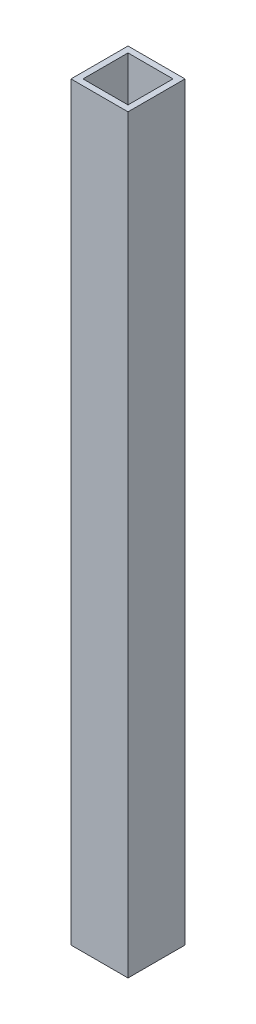
ISO-10303-21;
HEADER;
FILE_DESCRIPTION(('STEP AP214'),'2;1');
FILE_NAME('part.step','',(''),(''),'','','');
FILE_SCHEMA(('AUTOMOTIVE_DESIGN { 1 0 10303 214 1 1 1 1 }'));
ENDSEC;
DATA;
#1=APPLICATION_CONTEXT('core data for automotive mechanical design processes');
#2=APPLICATION_PROTOCOL_DEFINITION('international standard','automotive_design',2000,#1);
#3=PRODUCT_CONTEXT('',#1,'mechanical');
#4=PRODUCT('Part','Part','',(#3));
#5=PRODUCT_RELATED_PRODUCT_CATEGORY('part','',(#4));
#6=PRODUCT_DEFINITION_FORMATION('','',#4);
#7=PRODUCT_DEFINITION_CONTEXT('part definition',#1,'design');
#8=PRODUCT_DEFINITION('design','',#6,#7);
#9=PRODUCT_DEFINITION_SHAPE('','',#8);
#10=(LENGTH_UNIT() NAMED_UNIT(*) SI_UNIT(.MILLI.,.METRE.));
#11=(NAMED_UNIT(*) PLANE_ANGLE_UNIT() SI_UNIT($,.RADIAN.));
#12=(NAMED_UNIT(*) SI_UNIT($,.STERADIAN.) SOLID_ANGLE_UNIT());
#13=UNCERTAINTY_MEASURE_WITH_UNIT(LENGTH_MEASURE(1.E-05),#10,'distance_accuracy_value','');
#14=(GEOMETRIC_REPRESENTATION_CONTEXT(3) GLOBAL_UNCERTAINTY_ASSIGNED_CONTEXT((#13)) GLOBAL_UNIT_ASSIGNED_CONTEXT((#10,
#11,#12)) REPRESENTATION_CONTEXT('',''));
#15=CARTESIAN_POINT('',(0.,0.,0.));
#16=DIRECTION('',(0.,0.,1.));
#17=DIRECTION('',(1.,0.,0.));
#18=AXIS2_PLACEMENT_3D('',#15,#16,#17);
#19=CARTESIAN_POINT('',(0.,250.,0.));
#20=DIRECTION('',(0.,-1.,0.));
#21=DIRECTION('',(0.,0.,-1.));
#22=AXIS2_PLACEMENT_3D('',#19,#20,#21);
#23=PLANE('',#22);
#24=DIRECTION('',(0.,0.,-1.));
#25=VECTOR('',#24,1.);
#26=CARTESIAN_POINT('',(9.5,250.,9.5));
#27=LINE('',#26,#25);
#28=CARTESIAN_POINT('',(9.5,250.,9.5));
#29=VERTEX_POINT('',#28);
#30=CARTESIAN_POINT('',(9.5,250.,-9.5));
#31=VERTEX_POINT('',#30);
#32=EDGE_CURVE('E137',#29,#31,#27,.T.);
#33=ORIENTED_EDGE('',*,*,#32,.T.);
#34=DIRECTION('',(-1.,0.,0.));
#35=VECTOR('',#34,1.);
#36=CARTESIAN_POINT('',(-9.5,250.,-9.5));
#37=LINE('',#36,#35);
#38=CARTESIAN_POINT('',(-9.5,250.,-9.5));
#39=VERTEX_POINT('',#38);
#40=EDGE_CURVE('E140',#31,#39,#37,.T.);
#41=ORIENTED_EDGE('',*,*,#40,.T.);
#42=DIRECTION('',(0.,0.,1.));
#43=VECTOR('',#42,1.);
#44=CARTESIAN_POINT('',(-9.5,250.,9.5));
#45=LINE('',#44,#43);
#46=CARTESIAN_POINT('',(-9.5,250.,9.5));
#47=VERTEX_POINT('',#46);
#48=EDGE_CURVE('E143',#39,#47,#45,.T.);
#49=ORIENTED_EDGE('',*,*,#48,.T.);
#50=DIRECTION('',(1.,0.,0.));
#51=VECTOR('',#50,1.);
#52=CARTESIAN_POINT('',(-9.5,250.,9.5));
#53=LINE('',#52,#51);
#54=EDGE_CURVE('E145',#47,#29,#53,.T.);
#55=ORIENTED_EDGE('',*,*,#54,.T.);
#56=EDGE_LOOP('',(#33,#41,#49,#55));
#57=FACE_BOUND('',#56,.T.);
#58=DIRECTION('',(0.,0.,1.));
#59=VECTOR('',#58,1.);
#60=CARTESIAN_POINT('',(-7.5,250.,7.5));
#61=LINE('',#60,#59);
#62=CARTESIAN_POINT('',(-7.5,250.,-7.5));
#63=VERTEX_POINT('',#62);
#64=CARTESIAN_POINT('',(-7.5,250.,7.5));
#65=VERTEX_POINT('',#64);
#66=EDGE_CURVE('E101',#63,#65,#61,.T.);
#67=ORIENTED_EDGE('',*,*,#66,.F.);
#68=DIRECTION('',(-1.,0.,0.));
#69=VECTOR('',#68,1.);
#70=CARTESIAN_POINT('',(-7.5,250.,-7.5));
#71=LINE('',#70,#69);
#72=CARTESIAN_POINT('',(7.5,250.,-7.5));
#73=VERTEX_POINT('',#72);
#74=EDGE_CURVE('E123',#73,#63,#71,.T.);
#75=ORIENTED_EDGE('',*,*,#74,.F.);
#76=DIRECTION('',(0.,0.,-1.));
#77=VECTOR('',#76,1.);
#78=CARTESIAN_POINT('',(7.5,250.,7.5));
#79=LINE('',#78,#77);
#80=CARTESIAN_POINT('',(7.5,250.,7.5));
#81=VERTEX_POINT('',#80);
#82=EDGE_CURVE('E121',#81,#73,#79,.T.);
#83=ORIENTED_EDGE('',*,*,#82,.F.);
#84=DIRECTION('',(1.,0.,0.));
#85=VECTOR('',#84,1.);
#86=CARTESIAN_POINT('',(-7.5,250.,7.5));
#87=LINE('',#86,#85);
#88=EDGE_CURVE('E109',#65,#81,#87,.T.);
#89=ORIENTED_EDGE('',*,*,#88,.F.);
#90=EDGE_LOOP('',(#67,#75,#83,#89));
#91=FACE_BOUND('',#90,.T.);
#92=ADVANCED_FACE('F36',(#57,#91),#23,.F.);
#93=CARTESIAN_POINT('',(0.,0.,0.));
#94=DIRECTION('',(0.,-1.,0.));
#95=DIRECTION('',(0.,0.,-1.));
#96=AXIS2_PLACEMENT_3D('',#93,#94,#95);
#97=PLANE('',#96);
#98=DIRECTION('',(0.,0.,-1.));
#99=VECTOR('',#98,1.);
#100=CARTESIAN_POINT('',(9.5,0.,9.5));
#101=LINE('',#100,#99);
#102=CARTESIAN_POINT('',(9.5,0.,9.5));
#103=VERTEX_POINT('',#102);
#104=CARTESIAN_POINT('',(9.5,0.,-9.5));
#105=VERTEX_POINT('',#104);
#106=EDGE_CURVE('E117',#103,#105,#101,.T.);
#107=ORIENTED_EDGE('',*,*,#106,.F.);
#108=DIRECTION('',(1.,0.,0.));
#109=VECTOR('',#108,1.);
#110=CARTESIAN_POINT('',(-9.5,0.,9.5));
#111=LINE('',#110,#109);
#112=CARTESIAN_POINT('',(-9.5,0.,9.5));
#113=VERTEX_POINT('',#112);
#114=EDGE_CURVE('E141',#113,#103,#111,.T.);
#115=ORIENTED_EDGE('',*,*,#114,.F.);
#116=DIRECTION('',(0.,0.,1.));
#117=VECTOR('',#116,1.);
#118=CARTESIAN_POINT('',(-9.5,0.,9.5));
#119=LINE('',#118,#117);
#120=CARTESIAN_POINT('',(-9.5,0.,-9.5));
#121=VERTEX_POINT('',#120);
#122=EDGE_CURVE('E152',#121,#113,#119,.T.);
#123=ORIENTED_EDGE('',*,*,#122,.F.);
#124=DIRECTION('',(-1.,0.,0.));
#125=VECTOR('',#124,1.);
#126=CARTESIAN_POINT('',(-9.5,0.,-9.5));
#127=LINE('',#126,#125);
#128=EDGE_CURVE('E150',#105,#121,#127,.T.);
#129=ORIENTED_EDGE('',*,*,#128,.F.);
#130=EDGE_LOOP('',(#107,#115,#123,#129));
#131=FACE_BOUND('',#130,.T.);
#132=DIRECTION('',(-1.,0.,0.));
#133=VECTOR('',#132,1.);
#134=CARTESIAN_POINT('',(-7.5,0.,-7.5));
#135=LINE('',#134,#133);
#136=CARTESIAN_POINT('',(7.5,0.,-7.5));
#137=VERTEX_POINT('',#136);
#138=CARTESIAN_POINT('',(-7.5,0.,-7.5));
#139=VERTEX_POINT('',#138);
#140=EDGE_CURVE('E110',#137,#139,#135,.T.);
#141=ORIENTED_EDGE('',*,*,#140,.T.);
#142=DIRECTION('',(0.,0.,1.));
#143=VECTOR('',#142,1.);
#144=CARTESIAN_POINT('',(-7.5,0.,7.5));
#145=LINE('',#144,#143);
#146=CARTESIAN_POINT('',(-7.5,0.,7.5));
#147=VERTEX_POINT('',#146);
#148=EDGE_CURVE('E59',#139,#147,#145,.T.);
#149=ORIENTED_EDGE('',*,*,#148,.T.);
#150=DIRECTION('',(1.,0.,0.));
#151=VECTOR('',#150,1.);
#152=CARTESIAN_POINT('',(-7.5,0.,7.5));
#153=LINE('',#152,#151);
#154=CARTESIAN_POINT('',(7.5,0.,7.5));
#155=VERTEX_POINT('',#154);
#156=EDGE_CURVE('E116',#147,#155,#153,.T.);
#157=ORIENTED_EDGE('',*,*,#156,.T.);
#158=DIRECTION('',(0.,0.,-1.));
#159=VECTOR('',#158,1.);
#160=CARTESIAN_POINT('',(7.5,0.,7.5));
#161=LINE('',#160,#159);
#162=EDGE_CURVE('E129',#155,#137,#161,.T.);
#163=ORIENTED_EDGE('',*,*,#162,.T.);
#164=EDGE_LOOP('',(#141,#149,#157,#163));
#165=FACE_BOUND('',#164,.T.);
#166=ADVANCED_FACE('F170',(#131,#165),#97,.T.);
#167=CARTESIAN_POINT('',(9.5,250.,9.5));
#168=DIRECTION('',(-1.,0.,0.));
#169=DIRECTION('',(0.,0.,1.));
#170=AXIS2_PLACEMENT_3D('',#167,#168,#169);
#171=PLANE('',#170);
#172=ORIENTED_EDGE('',*,*,#106,.T.);
#173=DIRECTION('',(0.,-1.,0.));
#174=VECTOR('',#173,1.);
#175=CARTESIAN_POINT('',(9.5,250.,-9.5));
#176=LINE('',#175,#174);
#177=EDGE_CURVE('E11',#31,#105,#176,.T.);
#178=ORIENTED_EDGE('',*,*,#177,.F.);
#179=ORIENTED_EDGE('',*,*,#32,.F.);
#180=DIRECTION('',(0.,-1.,0.));
#181=VECTOR('',#180,1.);
#182=CARTESIAN_POINT('',(9.5,250.,9.5));
#183=LINE('',#182,#181);
#184=EDGE_CURVE('E147',#29,#103,#183,.T.);
#185=ORIENTED_EDGE('',*,*,#184,.T.);
#186=EDGE_LOOP('',(#172,#178,#179,#185));
#187=FACE_BOUND('',#186,.T.);
#188=ADVANCED_FACE('F38',(#187),#171,.F.);
#189=CARTESIAN_POINT('',(-9.5,250.,-9.5));
#190=DIRECTION('',(0.,0.,1.));
#191=DIRECTION('',(1.,0.,0.));
#192=AXIS2_PLACEMENT_3D('',#189,#190,#191);
#193=PLANE('',#192);
#194=ORIENTED_EDGE('',*,*,#128,.T.);
#195=DIRECTION('',(0.,-1.,0.));
#196=VECTOR('',#195,1.);
#197=CARTESIAN_POINT('',(-9.5,250.,-9.5));
#198=LINE('',#197,#196);
#199=EDGE_CURVE('E44',#39,#121,#198,.T.);
#200=ORIENTED_EDGE('',*,*,#199,.F.);
#201=ORIENTED_EDGE('',*,*,#40,.F.);
#202=ORIENTED_EDGE('',*,*,#177,.T.);
#203=EDGE_LOOP('',(#194,#200,#201,#202));
#204=FACE_BOUND('',#203,.T.);
#205=ADVANCED_FACE('F180',(#204),#193,.F.);
#206=CARTESIAN_POINT('',(-9.5,250.,9.5));
#207=DIRECTION('',(1.,0.,0.));
#208=DIRECTION('',(0.,0.,-1.));
#209=AXIS2_PLACEMENT_3D('',#206,#207,#208);
#210=PLANE('',#209);
#211=ORIENTED_EDGE('',*,*,#122,.T.);
#212=DIRECTION('',(0.,-1.,0.));
#213=VECTOR('',#212,1.);
#214=CARTESIAN_POINT('',(-9.5,250.,9.5));
#215=LINE('',#214,#213);
#216=EDGE_CURVE('E157',#47,#113,#215,.T.);
#217=ORIENTED_EDGE('',*,*,#216,.F.);
#218=ORIENTED_EDGE('',*,*,#48,.F.);
#219=ORIENTED_EDGE('',*,*,#199,.T.);
#220=EDGE_LOOP('',(#211,#217,#218,#219));
#221=FACE_BOUND('',#220,.T.);
#222=ADVANCED_FACE('F164',(#221),#210,.F.);
#223=CARTESIAN_POINT('',(-9.5,250.,9.5));
#224=DIRECTION('',(0.,0.,-1.));
#225=DIRECTION('',(-1.,0.,0.));
#226=AXIS2_PLACEMENT_3D('',#223,#224,#225);
#227=PLANE('',#226);
#228=ORIENTED_EDGE('',*,*,#114,.T.);
#229=ORIENTED_EDGE('',*,*,#184,.F.);
#230=ORIENTED_EDGE('',*,*,#54,.F.);
#231=ORIENTED_EDGE('',*,*,#216,.T.);
#232=EDGE_LOOP('',(#228,#229,#230,#231));
#233=FACE_BOUND('',#232,.T.);
#234=ADVANCED_FACE('F174',(#233),#227,.F.);
#235=CARTESIAN_POINT('',(-7.5,250.,7.5));
#236=DIRECTION('',(1.,0.,0.));
#237=DIRECTION('',(0.,0.,-1.));
#238=AXIS2_PLACEMENT_3D('',#235,#236,#237);
#239=PLANE('',#238);
#240=ORIENTED_EDGE('',*,*,#148,.F.);
#241=DIRECTION('',(0.,-1.,0.));
#242=VECTOR('',#241,1.);
#243=CARTESIAN_POINT('',(-7.5,250.,-7.5));
#244=LINE('',#243,#242);
#245=EDGE_CURVE('E105',#63,#139,#244,.T.);
#246=ORIENTED_EDGE('',*,*,#245,.F.);
#247=ORIENTED_EDGE('',*,*,#66,.T.);
#248=DIRECTION('',(0.,-1.,0.));
#249=VECTOR('',#248,1.);
#250=CARTESIAN_POINT('',(-7.5,250.,7.5));
#251=LINE('',#250,#249);
#252=EDGE_CURVE('E104',#65,#147,#251,.T.);
#253=ORIENTED_EDGE('',*,*,#252,.T.);
#254=EDGE_LOOP('',(#240,#246,#247,#253));
#255=FACE_BOUND('',#254,.T.);
#256=ADVANCED_FACE('F103',(#255),#239,.T.);
#257=CARTESIAN_POINT('',(-7.5,250.,7.5));
#258=DIRECTION('',(0.,0.,-1.));
#259=DIRECTION('',(-1.,0.,0.));
#260=AXIS2_PLACEMENT_3D('',#257,#258,#259);
#261=PLANE('',#260);
#262=ORIENTED_EDGE('',*,*,#156,.F.);
#263=ORIENTED_EDGE('',*,*,#252,.F.);
#264=ORIENTED_EDGE('',*,*,#88,.T.);
#265=DIRECTION('',(0.,-1.,0.));
#266=VECTOR('',#265,1.);
#267=CARTESIAN_POINT('',(7.5,250.,7.5));
#268=LINE('',#267,#266);
#269=EDGE_CURVE('E118',#81,#155,#268,.T.);
#270=ORIENTED_EDGE('',*,*,#269,.T.);
#271=EDGE_LOOP('',(#262,#263,#264,#270));
#272=FACE_BOUND('',#271,.T.);
#273=ADVANCED_FACE('F113',(#272),#261,.T.);
#274=CARTESIAN_POINT('',(7.5,250.,7.5));
#275=DIRECTION('',(-1.,0.,0.));
#276=DIRECTION('',(0.,0.,1.));
#277=AXIS2_PLACEMENT_3D('',#274,#275,#276);
#278=PLANE('',#277);
#279=ORIENTED_EDGE('',*,*,#162,.F.);
#280=ORIENTED_EDGE('',*,*,#269,.F.);
#281=ORIENTED_EDGE('',*,*,#82,.T.);
#282=DIRECTION('',(0.,-1.,0.));
#283=VECTOR('',#282,1.);
#284=CARTESIAN_POINT('',(7.5,250.,-7.5));
#285=LINE('',#284,#283);
#286=EDGE_CURVE('E51',#73,#137,#285,.T.);
#287=ORIENTED_EDGE('',*,*,#286,.T.);
#288=EDGE_LOOP('',(#279,#280,#281,#287));
#289=FACE_BOUND('',#288,.T.);
#290=ADVANCED_FACE('F203',(#289),#278,.T.);
#291=CARTESIAN_POINT('',(-7.5,250.,-7.5));
#292=DIRECTION('',(0.,0.,1.));
#293=DIRECTION('',(1.,0.,0.));
#294=AXIS2_PLACEMENT_3D('',#291,#292,#293);
#295=PLANE('',#294);
#296=ORIENTED_EDGE('',*,*,#140,.F.);
#297=ORIENTED_EDGE('',*,*,#286,.F.);
#298=ORIENTED_EDGE('',*,*,#74,.T.);
#299=ORIENTED_EDGE('',*,*,#245,.T.);
#300=EDGE_LOOP('',(#296,#297,#298,#299));
#301=FACE_BOUND('',#300,.T.);
#302=ADVANCED_FACE('F207',(#301),#295,.T.);
#303=CLOSED_SHELL('',(#92,#166,#188,#205,#222,#234,#256,#273,#290,#302));
#304=MANIFOLD_SOLID_BREP('B2',#303);
#305=ADVANCED_BREP_SHAPE_REPRESENTATION('',(#18,#304),#14);
#306=SHAPE_DEFINITION_REPRESENTATION(#9,#305);
ENDSEC;
END-ISO-10303-21;
